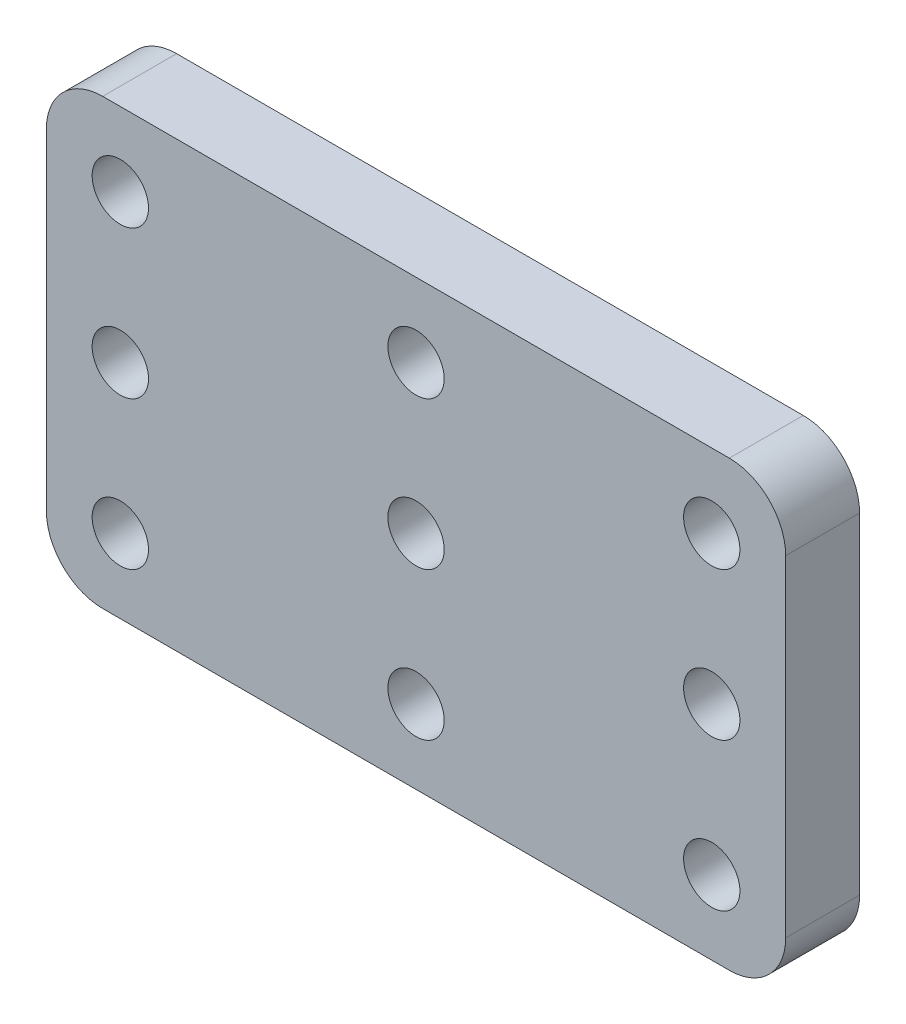
ISO-10303-21;
HEADER;
FILE_DESCRIPTION(('STEP AP214'),'2;1');
FILE_NAME('part.step','',(''),(''),'','','');
FILE_SCHEMA(('AUTOMOTIVE_DESIGN { 1 0 10303 214 1 1 1 1 }'));
ENDSEC;
DATA;
#1=APPLICATION_CONTEXT('core data for automotive mechanical design processes');
#2=APPLICATION_PROTOCOL_DEFINITION('international standard','automotive_design',2000,#1);
#3=PRODUCT_CONTEXT('',#1,'mechanical');
#4=PRODUCT('Part','Part','',(#3));
#5=PRODUCT_RELATED_PRODUCT_CATEGORY('part','',(#4));
#6=PRODUCT_DEFINITION_FORMATION('','',#4);
#7=PRODUCT_DEFINITION_CONTEXT('part definition',#1,'design');
#8=PRODUCT_DEFINITION('design','',#6,#7);
#9=PRODUCT_DEFINITION_SHAPE('','',#8);
#10=(LENGTH_UNIT() NAMED_UNIT(*) SI_UNIT(.MILLI.,.METRE.));
#11=(NAMED_UNIT(*) PLANE_ANGLE_UNIT() SI_UNIT($,.RADIAN.));
#12=(NAMED_UNIT(*) SI_UNIT($,.STERADIAN.) SOLID_ANGLE_UNIT());
#13=UNCERTAINTY_MEASURE_WITH_UNIT(LENGTH_MEASURE(1.E-05),#10,'distance_accuracy_value','');
#14=(GEOMETRIC_REPRESENTATION_CONTEXT(3) GLOBAL_UNCERTAINTY_ASSIGNED_CONTEXT((#13)) GLOBAL_UNIT_ASSIGNED_CONTEXT((#10,
#11,#12)) REPRESENTATION_CONTEXT('',''));
#15=CARTESIAN_POINT('',(0.,0.,0.));
#16=DIRECTION('',(0.,0.,1.));
#17=DIRECTION('',(1.,0.,0.));
#18=AXIS2_PLACEMENT_3D('',#15,#16,#17);
#19=CARTESIAN_POINT('',(24.99995,14.99997,4.99999));
#20=DIRECTION('',(-1.,0.,0.));
#21=DIRECTION('',(0.,-1.,0.));
#22=AXIS2_PLACEMENT_3D('',#19,#20,#21);
#23=PLANE('',#22);
#24=DIRECTION('',(0.,1.,0.));
#25=VECTOR('',#24,1.);
#26=CARTESIAN_POINT('',(24.99995,14.99997,0.));
#27=LINE('',#26,#25);
#28=CARTESIAN_POINT('',(24.99995,-11.18997,0.));
#29=VERTEX_POINT('',#28);
#30=CARTESIAN_POINT('',(24.99995,11.18997,0.));
#31=VERTEX_POINT('',#30);
#32=EDGE_CURVE('E126',#29,#31,#27,.T.);
#33=ORIENTED_EDGE('',*,*,#32,.T.);
#34=DIRECTION('',(0.,0.,-1.));
#35=VECTOR('',#34,1.);
#36=CARTESIAN_POINT('',(24.99995,11.18997,4.99999));
#37=LINE('',#36,#35);
#38=CARTESIAN_POINT('',(24.99995,11.18997,4.99999));
#39=VERTEX_POINT('',#38);
#40=EDGE_CURVE('E104',#31,#39,#37,.F.);
#41=ORIENTED_EDGE('',*,*,#40,.T.);
#42=DIRECTION('',(0.,1.,0.));
#43=VECTOR('',#42,1.);
#44=CARTESIAN_POINT('',(24.99995,14.99997,4.99999));
#45=LINE('',#44,#43);
#46=CARTESIAN_POINT('',(24.99995,-11.18997,4.99999));
#47=VERTEX_POINT('',#46);
#48=EDGE_CURVE('E136',#47,#39,#45,.T.);
#49=ORIENTED_EDGE('',*,*,#48,.F.);
#50=DIRECTION('',(0.,0.,-1.));
#51=VECTOR('',#50,1.);
#52=CARTESIAN_POINT('',(24.99995,-11.18997,4.99999));
#53=LINE('',#52,#51);
#54=EDGE_CURVE('E109',#47,#29,#53,.T.);
#55=ORIENTED_EDGE('',*,*,#54,.T.);
#56=EDGE_LOOP('',(#33,#41,#49,#55));
#57=FACE_BOUND('',#56,.T.);
#58=ADVANCED_FACE('F33',(#57),#23,.F.);
#59=CARTESIAN_POINT('',(-24.99995,14.99997,4.99999));
#60=DIRECTION('',(0.,-1.,0.));
#61=DIRECTION('',(0.,0.,-1.));
#62=AXIS2_PLACEMENT_3D('',#59,#60,#61);
#63=PLANE('',#62);
#64=DIRECTION('',(-1.,0.,0.));
#65=VECTOR('',#64,1.);
#66=CARTESIAN_POINT('',(-24.99995,14.99997,4.99999));
#67=LINE('',#66,#65);
#68=CARTESIAN_POINT('',(21.18995,14.99997,4.99999));
#69=VERTEX_POINT('',#68);
#70=CARTESIAN_POINT('',(-21.18995,14.99997,4.99999));
#71=VERTEX_POINT('',#70);
#72=EDGE_CURVE('E119',#69,#71,#67,.T.);
#73=ORIENTED_EDGE('',*,*,#72,.F.);
#74=DIRECTION('',(0.,0.,-1.));
#75=VECTOR('',#74,1.);
#76=CARTESIAN_POINT('',(21.18995,14.99997,4.99999));
#77=LINE('',#76,#75);
#78=CARTESIAN_POINT('',(21.18995,14.99997,0.));
#79=VERTEX_POINT('',#78);
#80=EDGE_CURVE('E103',#69,#79,#77,.T.);
#81=ORIENTED_EDGE('',*,*,#80,.T.);
#82=DIRECTION('',(-1.,0.,0.));
#83=VECTOR('',#82,1.);
#84=CARTESIAN_POINT('',(-24.99995,14.99997,0.));
#85=LINE('',#84,#83);
#86=CARTESIAN_POINT('',(-21.18995,14.99997,0.));
#87=VERTEX_POINT('',#86);
#88=EDGE_CURVE('E116',#79,#87,#85,.T.);
#89=ORIENTED_EDGE('',*,*,#88,.T.);
#90=DIRECTION('',(0.,0.,-1.));
#91=VECTOR('',#90,1.);
#92=CARTESIAN_POINT('',(-21.18995,14.99997,4.99999));
#93=LINE('',#92,#91);
#94=EDGE_CURVE('E121',#87,#71,#93,.F.);
#95=ORIENTED_EDGE('',*,*,#94,.T.);
#96=EDGE_LOOP('',(#73,#81,#89,#95));
#97=FACE_BOUND('',#96,.T.);
#98=ADVANCED_FACE('F115',(#97),#63,.F.);
#99=CARTESIAN_POINT('',(-24.99995,14.99997,4.99999));
#100=DIRECTION('',(1.,0.,0.));
#101=DIRECTION('',(0.,1.,0.));
#102=AXIS2_PLACEMENT_3D('',#99,#100,#101);
#103=PLANE('',#102);
#104=DIRECTION('',(0.,-1.,0.));
#105=VECTOR('',#104,1.);
#106=CARTESIAN_POINT('',(-24.99995,14.99997,0.));
#107=LINE('',#106,#105);
#108=CARTESIAN_POINT('',(-24.99995,11.18997,0.));
#109=VERTEX_POINT('',#108);
#110=CARTESIAN_POINT('',(-24.99995,-11.18997,0.));
#111=VERTEX_POINT('',#110);
#112=EDGE_CURVE('E125',#109,#111,#107,.T.);
#113=ORIENTED_EDGE('',*,*,#112,.T.);
#114=DIRECTION('',(0.,0.,-1.));
#115=VECTOR('',#114,1.);
#116=CARTESIAN_POINT('',(-24.99995,-11.18997,4.99999));
#117=LINE('',#116,#115);
#118=CARTESIAN_POINT('',(-24.99995,-11.18997,4.99999));
#119=VERTEX_POINT('',#118);
#120=EDGE_CURVE('E11',#111,#119,#117,.F.);
#121=ORIENTED_EDGE('',*,*,#120,.T.);
#122=DIRECTION('',(0.,-1.,0.));
#123=VECTOR('',#122,1.);
#124=CARTESIAN_POINT('',(-24.99995,14.99997,4.99999));
#125=LINE('',#124,#123);
#126=CARTESIAN_POINT('',(-24.99995,11.18997,4.99999));
#127=VERTEX_POINT('',#126);
#128=EDGE_CURVE('E162',#127,#119,#125,.T.);
#129=ORIENTED_EDGE('',*,*,#128,.F.);
#130=DIRECTION('',(0.,0.,-1.));
#131=VECTOR('',#130,1.);
#132=CARTESIAN_POINT('',(-24.99995,11.18997,4.99999));
#133=LINE('',#132,#131);
#134=EDGE_CURVE('E41',#127,#109,#133,.T.);
#135=ORIENTED_EDGE('',*,*,#134,.T.);
#136=EDGE_LOOP('',(#113,#121,#129,#135));
#137=FACE_BOUND('',#136,.T.);
#138=ADVANCED_FACE('F160',(#137),#103,.F.);
#139=CARTESIAN_POINT('',(-24.99995,-14.99997,4.99999));
#140=DIRECTION('',(0.,1.,0.));
#141=DIRECTION('',(0.,0.,1.));
#142=AXIS2_PLACEMENT_3D('',#139,#140,#141);
#143=PLANE('',#142);
#144=DIRECTION('',(1.,0.,0.));
#145=VECTOR('',#144,1.);
#146=CARTESIAN_POINT('',(-24.99995,-14.99997,0.));
#147=LINE('',#146,#145);
#148=CARTESIAN_POINT('',(-21.18995,-14.99997,0.));
#149=VERTEX_POINT('',#148);
#150=CARTESIAN_POINT('',(21.18995,-14.99997,0.));
#151=VERTEX_POINT('',#150);
#152=EDGE_CURVE('E129',#149,#151,#147,.T.);
#153=ORIENTED_EDGE('',*,*,#152,.T.);
#154=DIRECTION('',(0.,0.,-1.));
#155=VECTOR('',#154,1.);
#156=CARTESIAN_POINT('',(21.18995,-14.99997,4.99999));
#157=LINE('',#156,#155);
#158=CARTESIAN_POINT('',(21.18995,-14.99997,4.99999));
#159=VERTEX_POINT('',#158);
#160=EDGE_CURVE('E48',#151,#159,#157,.F.);
#161=ORIENTED_EDGE('',*,*,#160,.T.);
#162=DIRECTION('',(1.,0.,0.));
#163=VECTOR('',#162,1.);
#164=CARTESIAN_POINT('',(-24.99995,-14.99997,4.99999));
#165=LINE('',#164,#163);
#166=CARTESIAN_POINT('',(-21.18995,-14.99997,4.99999));
#167=VERTEX_POINT('',#166);
#168=EDGE_CURVE('E137',#167,#159,#165,.T.);
#169=ORIENTED_EDGE('',*,*,#168,.F.);
#170=DIRECTION('',(0.,0.,-1.));
#171=VECTOR('',#170,1.);
#172=CARTESIAN_POINT('',(-21.18995,-14.99997,4.99999));
#173=LINE('',#172,#171);
#174=EDGE_CURVE('E153',#167,#149,#173,.T.);
#175=ORIENTED_EDGE('',*,*,#174,.T.);
#176=EDGE_LOOP('',(#153,#161,#169,#175));
#177=FACE_BOUND('',#176,.T.);
#178=ADVANCED_FACE('F169',(#177),#143,.F.);
#179=CARTESIAN_POINT('',(0.,0.,4.99999));
#180=DIRECTION('',(0.,0.,1.));
#181=DIRECTION('',(1.,0.,0.));
#182=AXIS2_PLACEMENT_3D('',#179,#180,#181);
#183=PLANE('',#182);
#184=CARTESIAN_POINT('',(-19.99996,9.99998,4.99999));
#185=DIRECTION('',(0.,0.,1.));
#186=DIRECTION('',(1.,0.,0.));
#187=AXIS2_PLACEMENT_3D('',#184,#185,#186);
#188=CIRCLE('',#187,1.905);
#189=CARTESIAN_POINT('',(-18.09496,9.99998,4.99999));
#190=VERTEX_POINT('',#189);
#191=EDGE_CURVE('E222',#190,#190,#188,.T.);
#192=ORIENTED_EDGE('',*,*,#191,.F.);
#193=EDGE_LOOP('',(#192));
#194=FACE_BOUND('',#193,.T.);
#195=CARTESIAN_POINT('',(-19.99996,-9.99998000000001,4.99999));
#196=DIRECTION('',(0.,0.,1.));
#197=DIRECTION('',(1.,0.,0.));
#198=AXIS2_PLACEMENT_3D('',#195,#196,#197);
#199=CIRCLE('',#198,1.905);
#200=CARTESIAN_POINT('',(-18.09496,-9.99998000000001,4.99999));
#201=VERTEX_POINT('',#200);
#202=EDGE_CURVE('E221',#201,#201,#199,.T.);
#203=ORIENTED_EDGE('',*,*,#202,.F.);
#204=EDGE_LOOP('',(#203));
#205=FACE_BOUND('',#204,.T.);
#206=CARTESIAN_POINT('',(-19.99996,0.,4.99999));
#207=DIRECTION('',(0.,0.,1.));
#208=DIRECTION('',(1.,0.,0.));
#209=AXIS2_PLACEMENT_3D('',#206,#207,#208);
#210=CIRCLE('',#209,1.905);
#211=CARTESIAN_POINT('',(-18.09496,0.,4.99999));
#212=VERTEX_POINT('',#211);
#213=EDGE_CURVE('E214',#212,#212,#210,.T.);
#214=ORIENTED_EDGE('',*,*,#213,.F.);
#215=EDGE_LOOP('',(#214));
#216=FACE_BOUND('',#215,.T.);
#217=CARTESIAN_POINT('',(19.99996,9.99998000000001,4.99999));
#218=DIRECTION('',(0.,0.,1.));
#219=DIRECTION('',(1.,0.,0.));
#220=AXIS2_PLACEMENT_3D('',#217,#218,#219);
#221=CIRCLE('',#220,1.905);
#222=CARTESIAN_POINT('',(21.90496,9.99998000000001,4.99999));
#223=VERTEX_POINT('',#222);
#224=EDGE_CURVE('E204',#223,#223,#221,.T.);
#225=ORIENTED_EDGE('',*,*,#224,.F.);
#226=EDGE_LOOP('',(#225));
#227=FACE_BOUND('',#226,.T.);
#228=CARTESIAN_POINT('',(19.99996,-9.99998,4.99999));
#229=DIRECTION('',(0.,0.,1.));
#230=DIRECTION('',(1.,0.,0.));
#231=AXIS2_PLACEMENT_3D('',#228,#229,#230);
#232=CIRCLE('',#231,1.905);
#233=CARTESIAN_POINT('',(21.90496,-9.99998,4.99999));
#234=VERTEX_POINT('',#233);
#235=EDGE_CURVE('E203',#234,#234,#232,.T.);
#236=ORIENTED_EDGE('',*,*,#235,.F.);
#237=EDGE_LOOP('',(#236));
#238=FACE_BOUND('',#237,.T.);
#239=CARTESIAN_POINT('',(19.99996,0.,4.99999));
#240=DIRECTION('',(0.,0.,1.));
#241=DIRECTION('',(1.,0.,0.));
#242=AXIS2_PLACEMENT_3D('',#239,#240,#241);
#243=CIRCLE('',#242,1.905);
#244=CARTESIAN_POINT('',(21.90496,0.,4.99999));
#245=VERTEX_POINT('',#244);
#246=EDGE_CURVE('E196',#245,#245,#243,.T.);
#247=ORIENTED_EDGE('',*,*,#246,.F.);
#248=EDGE_LOOP('',(#247));
#249=FACE_BOUND('',#248,.T.);
#250=CARTESIAN_POINT('',(0.,9.99998,4.99999));
#251=DIRECTION('',(0.,0.,1.));
#252=DIRECTION('',(1.,0.,0.));
#253=AXIS2_PLACEMENT_3D('',#250,#251,#252);
#254=CIRCLE('',#253,1.905);
#255=CARTESIAN_POINT('',(1.905,9.99998,4.99999));
#256=VERTEX_POINT('',#255);
#257=EDGE_CURVE('E181',#256,#256,#254,.T.);
#258=ORIENTED_EDGE('',*,*,#257,.F.);
#259=EDGE_LOOP('',(#258));
#260=FACE_BOUND('',#259,.T.);
#261=CARTESIAN_POINT('',(0.,-9.99998,4.99999));
#262=DIRECTION('',(0.,0.,1.));
#263=DIRECTION('',(1.,0.,0.));
#264=AXIS2_PLACEMENT_3D('',#261,#262,#263);
#265=CIRCLE('',#264,1.905);
#266=CARTESIAN_POINT('',(1.905,-9.99998,4.99999));
#267=VERTEX_POINT('',#266);
#268=EDGE_CURVE('E182',#267,#267,#265,.T.);
#269=ORIENTED_EDGE('',*,*,#268,.F.);
#270=EDGE_LOOP('',(#269));
#271=FACE_BOUND('',#270,.T.);
#272=CARTESIAN_POINT('',(0.,0.,4.99999));
#273=DIRECTION('',(0.,0.,1.));
#274=DIRECTION('',(1.,0.,0.));
#275=AXIS2_PLACEMENT_3D('',#272,#273,#274);
#276=CIRCLE('',#275,1.905);
#277=CARTESIAN_POINT('',(1.905,0.,4.99999));
#278=VERTEX_POINT('',#277);
#279=EDGE_CURVE('E178',#278,#278,#276,.T.);
#280=ORIENTED_EDGE('',*,*,#279,.F.);
#281=EDGE_LOOP('',(#280));
#282=FACE_BOUND('',#281,.T.);
#283=ORIENTED_EDGE('',*,*,#48,.T.);
#284=CARTESIAN_POINT('',(21.18995,11.18997,4.99999));
#285=DIRECTION('',(0.,0.,1.));
#286=DIRECTION('',(1.,0.,0.));
#287=AXIS2_PLACEMENT_3D('',#284,#285,#286);
#288=CIRCLE('',#287,3.81);
#289=EDGE_CURVE('E151',#39,#69,#288,.T.);
#290=ORIENTED_EDGE('',*,*,#289,.T.);
#291=ORIENTED_EDGE('',*,*,#72,.T.);
#292=CARTESIAN_POINT('',(-21.18995,11.18997,4.99999));
#293=DIRECTION('',(0.,0.,1.));
#294=DIRECTION('',(1.,0.,0.));
#295=AXIS2_PLACEMENT_3D('',#292,#293,#294);
#296=CIRCLE('',#295,3.81);
#297=EDGE_CURVE('E146',#71,#127,#296,.T.);
#298=ORIENTED_EDGE('',*,*,#297,.T.);
#299=ORIENTED_EDGE('',*,*,#128,.T.);
#300=CARTESIAN_POINT('',(-21.18995,-11.18997,4.99999));
#301=DIRECTION('',(0.,0.,1.));
#302=DIRECTION('',(1.,0.,0.));
#303=AXIS2_PLACEMENT_3D('',#300,#301,#302);
#304=CIRCLE('',#303,3.81);
#305=EDGE_CURVE('E55',#119,#167,#304,.T.);
#306=ORIENTED_EDGE('',*,*,#305,.T.);
#307=ORIENTED_EDGE('',*,*,#168,.T.);
#308=CARTESIAN_POINT('',(21.18995,-11.18997,4.99999));
#309=DIRECTION('',(0.,0.,1.));
#310=DIRECTION('',(1.,0.,0.));
#311=AXIS2_PLACEMENT_3D('',#308,#309,#310);
#312=CIRCLE('',#311,3.81);
#313=EDGE_CURVE('E149',#159,#47,#312,.T.);
#314=ORIENTED_EDGE('',*,*,#313,.T.);
#315=EDGE_LOOP('',(#283,#290,#291,#298,#299,#306,#307,#314));
#316=FACE_BOUND('',#315,.T.);
#317=ADVANCED_FACE('F232',(#194,#205,#216,#227,#238,#249,#260,#271,#282,#316),#183,.T.);
#318=CARTESIAN_POINT('',(0.,0.,0.));
#319=DIRECTION('',(0.,0.,1.));
#320=DIRECTION('',(1.,0.,0.));
#321=AXIS2_PLACEMENT_3D('',#318,#319,#320);
#322=PLANE('',#321);
#323=CARTESIAN_POINT('',(-19.99996,9.99998,0.));
#324=DIRECTION('',(0.,0.,1.));
#325=DIRECTION('',(1.,0.,0.));
#326=AXIS2_PLACEMENT_3D('',#323,#324,#325);
#327=CIRCLE('',#326,1.905);
#328=CARTESIAN_POINT('',(-18.09496,9.99998,0.));
#329=VERTEX_POINT('',#328);
#330=EDGE_CURVE('E218',#329,#329,#327,.F.);
#331=ORIENTED_EDGE('',*,*,#330,.F.);
#332=EDGE_LOOP('',(#331));
#333=FACE_BOUND('',#332,.T.);
#334=CARTESIAN_POINT('',(-19.99996,-9.99998000000001,0.));
#335=DIRECTION('',(0.,0.,1.));
#336=DIRECTION('',(1.,0.,0.));
#337=AXIS2_PLACEMENT_3D('',#334,#335,#336);
#338=CIRCLE('',#337,1.905);
#339=CARTESIAN_POINT('',(-18.09496,-9.99998000000001,0.));
#340=VERTEX_POINT('',#339);
#341=EDGE_CURVE('E217',#340,#340,#338,.F.);
#342=ORIENTED_EDGE('',*,*,#341,.F.);
#343=EDGE_LOOP('',(#342));
#344=FACE_BOUND('',#343,.T.);
#345=CARTESIAN_POINT('',(-19.99996,0.,0.));
#346=DIRECTION('',(0.,0.,1.));
#347=DIRECTION('',(1.,0.,0.));
#348=AXIS2_PLACEMENT_3D('',#345,#346,#347);
#349=CIRCLE('',#348,1.905);
#350=CARTESIAN_POINT('',(-18.09496,0.,0.));
#351=VERTEX_POINT('',#350);
#352=EDGE_CURVE('E207',#351,#351,#349,.F.);
#353=ORIENTED_EDGE('',*,*,#352,.F.);
#354=EDGE_LOOP('',(#353));
#355=FACE_BOUND('',#354,.T.);
#356=CARTESIAN_POINT('',(19.99996,9.99998000000001,0.));
#357=DIRECTION('',(0.,0.,1.));
#358=DIRECTION('',(1.,0.,0.));
#359=AXIS2_PLACEMENT_3D('',#356,#357,#358);
#360=CIRCLE('',#359,1.905);
#361=CARTESIAN_POINT('',(21.90496,9.99998000000001,0.));
#362=VERTEX_POINT('',#361);
#363=EDGE_CURVE('E200',#362,#362,#360,.F.);
#364=ORIENTED_EDGE('',*,*,#363,.F.);
#365=EDGE_LOOP('',(#364));
#366=FACE_BOUND('',#365,.T.);
#367=CARTESIAN_POINT('',(19.99996,-9.99998,0.));
#368=DIRECTION('',(0.,0.,1.));
#369=DIRECTION('',(1.,0.,0.));
#370=AXIS2_PLACEMENT_3D('',#367,#368,#369);
#371=CIRCLE('',#370,1.905);
#372=CARTESIAN_POINT('',(21.90496,-9.99998,0.));
#373=VERTEX_POINT('',#372);
#374=EDGE_CURVE('E199',#373,#373,#371,.F.);
#375=ORIENTED_EDGE('',*,*,#374,.F.);
#376=EDGE_LOOP('',(#375));
#377=FACE_BOUND('',#376,.T.);
#378=CARTESIAN_POINT('',(19.99996,0.,0.));
#379=DIRECTION('',(0.,0.,1.));
#380=DIRECTION('',(1.,0.,0.));
#381=AXIS2_PLACEMENT_3D('',#378,#379,#380);
#382=CIRCLE('',#381,1.905);
#383=CARTESIAN_POINT('',(21.90496,0.,0.));
#384=VERTEX_POINT('',#383);
#385=EDGE_CURVE('E189',#384,#384,#382,.F.);
#386=ORIENTED_EDGE('',*,*,#385,.F.);
#387=EDGE_LOOP('',(#386));
#388=FACE_BOUND('',#387,.T.);
#389=CARTESIAN_POINT('',(0.,9.99998,0.));
#390=DIRECTION('',(0.,0.,1.));
#391=DIRECTION('',(1.,0.,0.));
#392=AXIS2_PLACEMENT_3D('',#389,#390,#391);
#393=CIRCLE('',#392,1.905);
#394=CARTESIAN_POINT('',(1.905,9.99998,0.));
#395=VERTEX_POINT('',#394);
#396=EDGE_CURVE('E185',#395,#395,#393,.F.);
#397=ORIENTED_EDGE('',*,*,#396,.F.);
#398=EDGE_LOOP('',(#397));
#399=FACE_BOUND('',#398,.T.);
#400=CARTESIAN_POINT('',(0.,-9.99998,0.));
#401=DIRECTION('',(0.,0.,1.));
#402=DIRECTION('',(1.,0.,0.));
#403=AXIS2_PLACEMENT_3D('',#400,#401,#402);
#404=CIRCLE('',#403,1.905);
#405=CARTESIAN_POINT('',(1.905,-9.99998,0.));
#406=VERTEX_POINT('',#405);
#407=EDGE_CURVE('E186',#406,#406,#404,.F.);
#408=ORIENTED_EDGE('',*,*,#407,.F.);
#409=EDGE_LOOP('',(#408));
#410=FACE_BOUND('',#409,.T.);
#411=CARTESIAN_POINT('',(0.,0.,0.));
#412=DIRECTION('',(0.,0.,1.));
#413=DIRECTION('',(1.,0.,0.));
#414=AXIS2_PLACEMENT_3D('',#411,#412,#413);
#415=CIRCLE('',#414,1.905);
#416=CARTESIAN_POINT('',(1.905,0.,0.));
#417=VERTEX_POINT('',#416);
#418=EDGE_CURVE('E131',#417,#417,#415,.F.);
#419=ORIENTED_EDGE('',*,*,#418,.F.);
#420=EDGE_LOOP('',(#419));
#421=FACE_BOUND('',#420,.T.);
#422=ORIENTED_EDGE('',*,*,#88,.F.);
#423=CARTESIAN_POINT('',(21.18995,11.18997,0.));
#424=DIRECTION('',(0.,0.,1.));
#425=DIRECTION('',(1.,0.,0.));
#426=AXIS2_PLACEMENT_3D('',#423,#424,#425);
#427=CIRCLE('',#426,3.81);
#428=EDGE_CURVE('E99',#79,#31,#427,.F.);
#429=ORIENTED_EDGE('',*,*,#428,.T.);
#430=ORIENTED_EDGE('',*,*,#32,.F.);
#431=CARTESIAN_POINT('',(21.18995,-11.18997,0.));
#432=DIRECTION('',(0.,0.,1.));
#433=DIRECTION('',(1.,0.,0.));
#434=AXIS2_PLACEMENT_3D('',#431,#432,#433);
#435=CIRCLE('',#434,3.81);
#436=EDGE_CURVE('E110',#29,#151,#435,.F.);
#437=ORIENTED_EDGE('',*,*,#436,.T.);
#438=ORIENTED_EDGE('',*,*,#152,.F.);
#439=CARTESIAN_POINT('',(-21.18995,-11.18997,0.));
#440=DIRECTION('',(0.,0.,1.));
#441=DIRECTION('',(1.,0.,0.));
#442=AXIS2_PLACEMENT_3D('',#439,#440,#441);
#443=CIRCLE('',#442,3.81);
#444=EDGE_CURVE('E140',#149,#111,#443,.F.);
#445=ORIENTED_EDGE('',*,*,#444,.T.);
#446=ORIENTED_EDGE('',*,*,#112,.F.);
#447=CARTESIAN_POINT('',(-21.18995,11.18997,0.));
#448=DIRECTION('',(0.,0.,1.));
#449=DIRECTION('',(1.,0.,0.));
#450=AXIS2_PLACEMENT_3D('',#447,#448,#449);
#451=CIRCLE('',#450,3.81);
#452=EDGE_CURVE('E120',#109,#87,#451,.F.);
#453=ORIENTED_EDGE('',*,*,#452,.T.);
#454=EDGE_LOOP('',(#422,#429,#430,#437,#438,#445,#446,#453));
#455=FACE_BOUND('',#454,.T.);
#456=ADVANCED_FACE('F123',(#333,#344,#355,#366,#377,#388,#399,#410,#421,#455),#322,.F.);
#457=CARTESIAN_POINT('',(0.,0.,-5.38815367264149));
#458=DIRECTION('',(0.,0.,1.));
#459=DIRECTION('',(1.,0.,0.));
#460=AXIS2_PLACEMENT_3D('',#457,#458,#459);
#461=CYLINDRICAL_SURFACE('',#460,1.905);
#462=ORIENTED_EDGE('',*,*,#418,.T.);
#463=EDGE_LOOP('',(#462));
#464=FACE_BOUND('',#463,.T.);
#465=ORIENTED_EDGE('',*,*,#279,.T.);
#466=EDGE_LOOP('',(#465));
#467=FACE_BOUND('',#466,.T.);
#468=ADVANCED_FACE('F275',(#464,#467),#461,.F.);
#469=CARTESIAN_POINT('',(0.,-9.99998,-5.38815367264149));
#470=DIRECTION('',(0.,0.,1.));
#471=DIRECTION('',(1.,0.,0.));
#472=AXIS2_PLACEMENT_3D('',#469,#470,#471);
#473=CYLINDRICAL_SURFACE('',#472,1.905);
#474=ORIENTED_EDGE('',*,*,#407,.T.);
#475=EDGE_LOOP('',(#474));
#476=FACE_BOUND('',#475,.T.);
#477=ORIENTED_EDGE('',*,*,#268,.T.);
#478=EDGE_LOOP('',(#477));
#479=FACE_BOUND('',#478,.T.);
#480=ADVANCED_FACE('F280',(#476,#479),#473,.F.);
#481=CARTESIAN_POINT('',(0.,9.99998,-5.38815367264149));
#482=DIRECTION('',(0.,0.,1.));
#483=DIRECTION('',(1.,0.,0.));
#484=AXIS2_PLACEMENT_3D('',#481,#482,#483);
#485=CYLINDRICAL_SURFACE('',#484,1.905);
#486=ORIENTED_EDGE('',*,*,#396,.T.);
#487=EDGE_LOOP('',(#486));
#488=FACE_BOUND('',#487,.T.);
#489=ORIENTED_EDGE('',*,*,#257,.T.);
#490=EDGE_LOOP('',(#489));
#491=FACE_BOUND('',#490,.T.);
#492=ADVANCED_FACE('F284',(#488,#491),#485,.F.);
#493=CARTESIAN_POINT('',(19.99996,0.,-5.38815367264149));
#494=DIRECTION('',(0.,0.,1.));
#495=DIRECTION('',(1.,0.,0.));
#496=AXIS2_PLACEMENT_3D('',#493,#494,#495);
#497=CYLINDRICAL_SURFACE('',#496,1.905);
#498=ORIENTED_EDGE('',*,*,#385,.T.);
#499=EDGE_LOOP('',(#498));
#500=FACE_BOUND('',#499,.T.);
#501=ORIENTED_EDGE('',*,*,#246,.T.);
#502=EDGE_LOOP('',(#501));
#503=FACE_BOUND('',#502,.T.);
#504=ADVANCED_FACE('F288',(#500,#503),#497,.F.);
#505=CARTESIAN_POINT('',(19.99996,-9.99998,-5.38815367264149));
#506=DIRECTION('',(0.,0.,1.));
#507=DIRECTION('',(1.,0.,0.));
#508=AXIS2_PLACEMENT_3D('',#505,#506,#507);
#509=CYLINDRICAL_SURFACE('',#508,1.905);
#510=ORIENTED_EDGE('',*,*,#374,.T.);
#511=EDGE_LOOP('',(#510));
#512=FACE_BOUND('',#511,.T.);
#513=ORIENTED_EDGE('',*,*,#235,.T.);
#514=EDGE_LOOP('',(#513));
#515=FACE_BOUND('',#514,.T.);
#516=ADVANCED_FACE('F292',(#512,#515),#509,.F.);
#517=CARTESIAN_POINT('',(19.99996,9.99998000000001,-5.38815367264149));
#518=DIRECTION('',(0.,0.,1.));
#519=DIRECTION('',(1.,0.,0.));
#520=AXIS2_PLACEMENT_3D('',#517,#518,#519);
#521=CYLINDRICAL_SURFACE('',#520,1.905);
#522=ORIENTED_EDGE('',*,*,#363,.T.);
#523=EDGE_LOOP('',(#522));
#524=FACE_BOUND('',#523,.T.);
#525=ORIENTED_EDGE('',*,*,#224,.T.);
#526=EDGE_LOOP('',(#525));
#527=FACE_BOUND('',#526,.T.);
#528=ADVANCED_FACE('F294',(#524,#527),#521,.F.);
#529=CARTESIAN_POINT('',(-19.99996,0.,-5.38815367264149));
#530=DIRECTION('',(0.,0.,1.));
#531=DIRECTION('',(1.,0.,0.));
#532=AXIS2_PLACEMENT_3D('',#529,#530,#531);
#533=CYLINDRICAL_SURFACE('',#532,1.905);
#534=ORIENTED_EDGE('',*,*,#352,.T.);
#535=EDGE_LOOP('',(#534));
#536=FACE_BOUND('',#535,.T.);
#537=ORIENTED_EDGE('',*,*,#213,.T.);
#538=EDGE_LOOP('',(#537));
#539=FACE_BOUND('',#538,.T.);
#540=ADVANCED_FACE('F297',(#536,#539),#533,.F.);
#541=CARTESIAN_POINT('',(-19.99996,-9.99998000000001,-5.38815367264149));
#542=DIRECTION('',(0.,0.,1.));
#543=DIRECTION('',(1.,0.,0.));
#544=AXIS2_PLACEMENT_3D('',#541,#542,#543);
#545=CYLINDRICAL_SURFACE('',#544,1.905);
#546=ORIENTED_EDGE('',*,*,#341,.T.);
#547=EDGE_LOOP('',(#546));
#548=FACE_BOUND('',#547,.T.);
#549=ORIENTED_EDGE('',*,*,#202,.T.);
#550=EDGE_LOOP('',(#549));
#551=FACE_BOUND('',#550,.T.);
#552=ADVANCED_FACE('F230',(#548,#551),#545,.F.);
#553=CARTESIAN_POINT('',(-19.99996,9.99998,-5.38815367264149));
#554=DIRECTION('',(0.,0.,1.));
#555=DIRECTION('',(1.,0.,0.));
#556=AXIS2_PLACEMENT_3D('',#553,#554,#555);
#557=CYLINDRICAL_SURFACE('',#556,1.905);
#558=ORIENTED_EDGE('',*,*,#330,.T.);
#559=EDGE_LOOP('',(#558));
#560=FACE_BOUND('',#559,.T.);
#561=ORIENTED_EDGE('',*,*,#191,.T.);
#562=EDGE_LOOP('',(#561));
#563=FACE_BOUND('',#562,.T.);
#564=ADVANCED_FACE('F261',(#560,#563),#557,.F.);
#565=CARTESIAN_POINT('',(21.18995,11.18997,4.99999));
#566=DIRECTION('',(0.,0.,-1.));
#567=DIRECTION('',(-1.,0.,0.));
#568=AXIS2_PLACEMENT_3D('',#565,#566,#567);
#569=CYLINDRICAL_SURFACE('',#568,3.81);
#570=ORIENTED_EDGE('',*,*,#289,.F.);
#571=ORIENTED_EDGE('',*,*,#40,.F.);
#572=ORIENTED_EDGE('',*,*,#428,.F.);
#573=ORIENTED_EDGE('',*,*,#80,.F.);
#574=EDGE_LOOP('',(#570,#571,#572,#573));
#575=FACE_BOUND('',#574,.T.);
#576=ADVANCED_FACE('F102',(#575),#569,.T.);
#577=CARTESIAN_POINT('',(21.18995,-11.18997,4.99999));
#578=DIRECTION('',(0.,0.,-1.));
#579=DIRECTION('',(-1.,0.,0.));
#580=AXIS2_PLACEMENT_3D('',#577,#578,#579);
#581=CYLINDRICAL_SURFACE('',#580,3.81);
#582=ORIENTED_EDGE('',*,*,#313,.F.);
#583=ORIENTED_EDGE('',*,*,#160,.F.);
#584=ORIENTED_EDGE('',*,*,#436,.F.);
#585=ORIENTED_EDGE('',*,*,#54,.F.);
#586=EDGE_LOOP('',(#582,#583,#584,#585));
#587=FACE_BOUND('',#586,.T.);
#588=ADVANCED_FACE('F254',(#587),#581,.T.);
#589=CARTESIAN_POINT('',(-21.18995,-11.18997,4.99999));
#590=DIRECTION('',(0.,0.,-1.));
#591=DIRECTION('',(-1.,0.,0.));
#592=AXIS2_PLACEMENT_3D('',#589,#590,#591);
#593=CYLINDRICAL_SURFACE('',#592,3.81);
#594=ORIENTED_EDGE('',*,*,#305,.F.);
#595=ORIENTED_EDGE('',*,*,#120,.F.);
#596=ORIENTED_EDGE('',*,*,#444,.F.);
#597=ORIENTED_EDGE('',*,*,#174,.F.);
#598=EDGE_LOOP('',(#594,#595,#596,#597));
#599=FACE_BOUND('',#598,.T.);
#600=ADVANCED_FACE('F168',(#599),#593,.T.);
#601=CARTESIAN_POINT('',(-21.18995,11.18997,4.99999));
#602=DIRECTION('',(0.,0.,-1.));
#603=DIRECTION('',(-1.,0.,0.));
#604=AXIS2_PLACEMENT_3D('',#601,#602,#603);
#605=CYLINDRICAL_SURFACE('',#604,3.81);
#606=ORIENTED_EDGE('',*,*,#297,.F.);
#607=ORIENTED_EDGE('',*,*,#94,.F.);
#608=ORIENTED_EDGE('',*,*,#452,.F.);
#609=ORIENTED_EDGE('',*,*,#134,.F.);
#610=EDGE_LOOP('',(#606,#607,#608,#609));
#611=FACE_BOUND('',#610,.T.);
#612=ADVANCED_FACE('F35',(#611),#605,.T.);
#613=CLOSED_SHELL('',(#58,#98,#138,#178,#317,#456,#468,#480,#492,#504,#516,#528,#540,#552,#564,
#576,#588,#600,#612));
#614=MANIFOLD_SOLID_BREP('B2',#613);
#615=ADVANCED_BREP_SHAPE_REPRESENTATION('',(#18,#614),#14);
#616=SHAPE_DEFINITION_REPRESENTATION(#9,#615);
ENDSEC;
END-ISO-10303-21;
